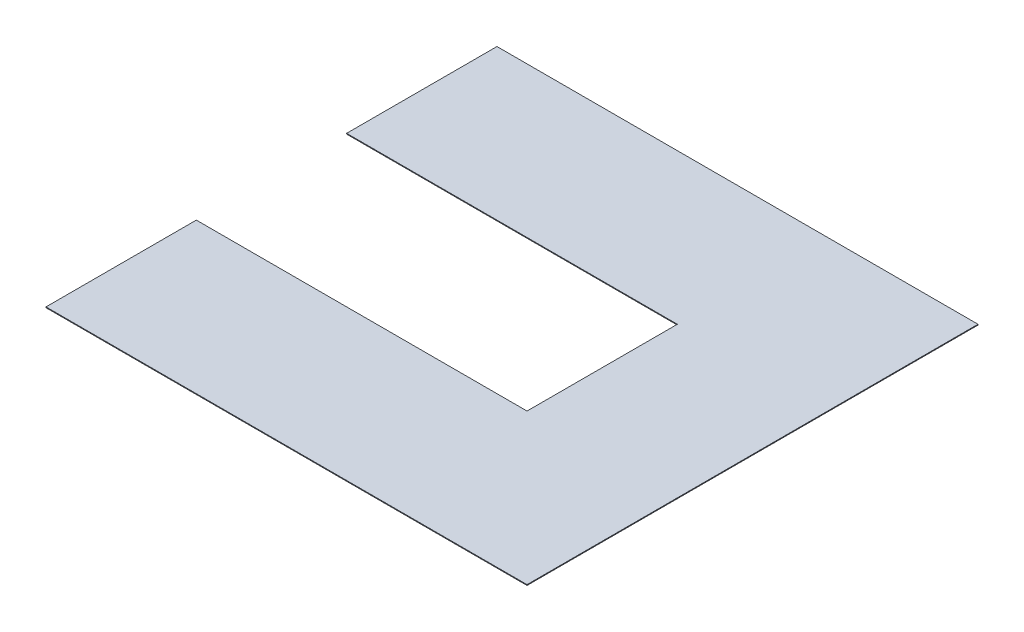
ISO-10303-21;
HEADER;
FILE_DESCRIPTION(('STEP AP214'),'2;1');
FILE_NAME('part.step','',(''),(''),'','','');
FILE_SCHEMA(('AUTOMOTIVE_DESIGN { 1 0 10303 214 1 1 1 1 }'));
ENDSEC;
DATA;
#1=APPLICATION_CONTEXT('core data for automotive mechanical design processes');
#2=APPLICATION_PROTOCOL_DEFINITION('international standard','automotive_design',2000,#1);
#3=PRODUCT_CONTEXT('',#1,'mechanical');
#4=PRODUCT('Part','Part','',(#3));
#5=PRODUCT_RELATED_PRODUCT_CATEGORY('part','',(#4));
#6=PRODUCT_DEFINITION_FORMATION('','',#4);
#7=PRODUCT_DEFINITION_CONTEXT('part definition',#1,'design');
#8=PRODUCT_DEFINITION('design','',#6,#7);
#9=PRODUCT_DEFINITION_SHAPE('','',#8);
#10=(LENGTH_UNIT() NAMED_UNIT(*) SI_UNIT(.MILLI.,.METRE.));
#11=(NAMED_UNIT(*) PLANE_ANGLE_UNIT() SI_UNIT($,.RADIAN.));
#12=(NAMED_UNIT(*) SI_UNIT($,.STERADIAN.) SOLID_ANGLE_UNIT());
#13=UNCERTAINTY_MEASURE_WITH_UNIT(LENGTH_MEASURE(1.E-05),#10,'distance_accuracy_value','');
#14=(GEOMETRIC_REPRESENTATION_CONTEXT(3) GLOBAL_UNCERTAINTY_ASSIGNED_CONTEXT((#13)) GLOBAL_UNIT_ASSIGNED_CONTEXT((#10,
#11,#12)) REPRESENTATION_CONTEXT('',''));
#15=CARTESIAN_POINT('',(0.,0.,0.));
#16=DIRECTION('',(0.,0.,1.));
#17=DIRECTION('',(1.,0.,0.));
#18=AXIS2_PLACEMENT_3D('',#15,#16,#17);
#19=CARTESIAN_POINT('',(8.,0.0126,-3.75));
#20=DIRECTION('',(0.,0.,1.));
#21=DIRECTION('',(1.,0.,0.));
#22=AXIS2_PLACEMENT_3D('',#19,#20,#21);
#23=PLANE('',#22);
#24=DIRECTION('',(-1.,0.,0.));
#25=VECTOR('',#24,1.);
#26=CARTESIAN_POINT('',(8.,0.,-3.75));
#27=LINE('',#26,#25);
#28=CARTESIAN_POINT('',(8.,0.,-3.75));
#29=VERTEX_POINT('',#28);
#30=CARTESIAN_POINT('',(0.,0.,-3.75));
#31=VERTEX_POINT('',#30);
#32=EDGE_CURVE('E140',#29,#31,#27,.T.);
#33=ORIENTED_EDGE('',*,*,#32,.T.);
#34=DIRECTION('',(0.,-1.,0.));
#35=VECTOR('',#34,1.);
#36=CARTESIAN_POINT('',(0.,0.0126,-3.75));
#37=LINE('',#36,#35);
#38=CARTESIAN_POINT('',(0.,0.0126,-3.75));
#39=VERTEX_POINT('',#38);
#40=EDGE_CURVE('E11',#39,#31,#37,.T.);
#41=ORIENTED_EDGE('',*,*,#40,.F.);
#42=DIRECTION('',(-1.,0.,0.));
#43=VECTOR('',#42,1.);
#44=CARTESIAN_POINT('',(8.,0.0126,-3.75));
#45=LINE('',#44,#43);
#46=CARTESIAN_POINT('',(8.,0.0126,-3.75));
#47=VERTEX_POINT('',#46);
#48=EDGE_CURVE('E162',#47,#39,#45,.T.);
#49=ORIENTED_EDGE('',*,*,#48,.F.);
#50=DIRECTION('',(0.,-1.,0.));
#51=VECTOR('',#50,1.);
#52=CARTESIAN_POINT('',(8.,0.0126,-3.75));
#53=LINE('',#52,#51);
#54=EDGE_CURVE('E136',#47,#29,#53,.T.);
#55=ORIENTED_EDGE('',*,*,#54,.T.);
#56=EDGE_LOOP('',(#33,#41,#49,#55));
#57=FACE_BOUND('',#56,.T.);
#58=ADVANCED_FACE('F39',(#57),#23,.F.);
#59=CARTESIAN_POINT('',(0.,0.0126,-3.75));
#60=DIRECTION('',(1.,0.,0.));
#61=DIRECTION('',(0.,0.,-1.));
#62=AXIS2_PLACEMENT_3D('',#59,#60,#61);
#63=PLANE('',#62);
#64=DIRECTION('',(0.,0.,1.));
#65=VECTOR('',#64,1.);
#66=CARTESIAN_POINT('',(0.,0.,-3.75));
#67=LINE('',#66,#65);
#68=CARTESIAN_POINT('',(0.,0.,-1.25));
#69=VERTEX_POINT('',#68);
#70=EDGE_CURVE('E144',#31,#69,#67,.T.);
#71=ORIENTED_EDGE('',*,*,#70,.T.);
#72=DIRECTION('',(0.,-1.,0.));
#73=VECTOR('',#72,1.);
#74=CARTESIAN_POINT('',(0.,0.0126,-1.25));
#75=LINE('',#74,#73);
#76=CARTESIAN_POINT('',(0.,0.0126,-1.25));
#77=VERTEX_POINT('',#76);
#78=EDGE_CURVE('E48',#77,#69,#75,.T.);
#79=ORIENTED_EDGE('',*,*,#78,.F.);
#80=DIRECTION('',(0.,0.,1.));
#81=VECTOR('',#80,1.);
#82=CARTESIAN_POINT('',(0.,0.0126,-3.75));
#83=LINE('',#82,#81);
#84=EDGE_CURVE('E99',#39,#77,#83,.T.);
#85=ORIENTED_EDGE('',*,*,#84,.F.);
#86=ORIENTED_EDGE('',*,*,#40,.T.);
#87=EDGE_LOOP('',(#71,#79,#85,#86));
#88=FACE_BOUND('',#87,.T.);
#89=ADVANCED_FACE('F208',(#88),#63,.F.);
#90=CARTESIAN_POINT('',(0.,0.0126,-1.25));
#91=DIRECTION('',(0.,0.,-1.));
#92=DIRECTION('',(-1.,0.,0.));
#93=AXIS2_PLACEMENT_3D('',#90,#91,#92);
#94=PLANE('',#93);
#95=DIRECTION('',(1.,0.,0.));
#96=VECTOR('',#95,1.);
#97=CARTESIAN_POINT('',(0.,0.,-1.25));
#98=LINE('',#97,#96);
#99=CARTESIAN_POINT('',(5.5,0.,-1.25));
#100=VERTEX_POINT('',#99);
#101=EDGE_CURVE('E147',#69,#100,#98,.T.);
#102=ORIENTED_EDGE('',*,*,#101,.T.);
#103=DIRECTION('',(0.,-1.,0.));
#104=VECTOR('',#103,1.);
#105=CARTESIAN_POINT('',(5.5,0.0126,-1.25));
#106=LINE('',#105,#104);
#107=CARTESIAN_POINT('',(5.5,0.0126,-1.25));
#108=VERTEX_POINT('',#107);
#109=EDGE_CURVE('E173',#108,#100,#106,.T.);
#110=ORIENTED_EDGE('',*,*,#109,.F.);
#111=DIRECTION('',(1.,0.,0.));
#112=VECTOR('',#111,1.);
#113=CARTESIAN_POINT('',(0.,0.0126,-1.25));
#114=LINE('',#113,#112);
#115=EDGE_CURVE('E183',#77,#108,#114,.T.);
#116=ORIENTED_EDGE('',*,*,#115,.F.);
#117=ORIENTED_EDGE('',*,*,#78,.T.);
#118=EDGE_LOOP('',(#102,#110,#116,#117));
#119=FACE_BOUND('',#118,.T.);
#120=ADVANCED_FACE('F181',(#119),#94,.F.);
#121=CARTESIAN_POINT('',(5.5,0.0126,-1.25));
#122=DIRECTION('',(1.,0.,0.));
#123=DIRECTION('',(0.,0.,-1.));
#124=AXIS2_PLACEMENT_3D('',#121,#122,#123);
#125=PLANE('',#124);
#126=DIRECTION('',(0.,0.,1.));
#127=VECTOR('',#126,1.);
#128=CARTESIAN_POINT('',(5.5,0.,-1.25));
#129=LINE('',#128,#127);
#130=CARTESIAN_POINT('',(5.5,0.,1.25));
#131=VERTEX_POINT('',#130);
#132=EDGE_CURVE('E150',#100,#131,#129,.T.);
#133=ORIENTED_EDGE('',*,*,#132,.T.);
#134=DIRECTION('',(0.,-1.,0.));
#135=VECTOR('',#134,1.);
#136=CARTESIAN_POINT('',(5.5,0.0126,1.25));
#137=LINE('',#136,#135);
#138=CARTESIAN_POINT('',(5.5,0.0126,1.25));
#139=VERTEX_POINT('',#138);
#140=EDGE_CURVE('E169',#139,#131,#137,.T.);
#141=ORIENTED_EDGE('',*,*,#140,.F.);
#142=DIRECTION('',(0.,0.,1.));
#143=VECTOR('',#142,1.);
#144=CARTESIAN_POINT('',(5.5,0.0126,-1.25));
#145=LINE('',#144,#143);
#146=EDGE_CURVE('E196',#108,#139,#145,.T.);
#147=ORIENTED_EDGE('',*,*,#146,.F.);
#148=ORIENTED_EDGE('',*,*,#109,.T.);
#149=EDGE_LOOP('',(#133,#141,#147,#148));
#150=FACE_BOUND('',#149,.T.);
#151=ADVANCED_FACE('F191',(#150),#125,.F.);
#152=CARTESIAN_POINT('',(5.5,0.0126,1.25));
#153=DIRECTION('',(0.,0.,1.));
#154=DIRECTION('',(1.,0.,0.));
#155=AXIS2_PLACEMENT_3D('',#152,#153,#154);
#156=PLANE('',#155);
#157=DIRECTION('',(-1.,0.,0.));
#158=VECTOR('',#157,1.);
#159=CARTESIAN_POINT('',(5.5,0.,1.25));
#160=LINE('',#159,#158);
#161=CARTESIAN_POINT('',(0.,0.,1.25));
#162=VERTEX_POINT('',#161);
#163=EDGE_CURVE('E153',#131,#162,#160,.T.);
#164=ORIENTED_EDGE('',*,*,#163,.T.);
#165=DIRECTION('',(0.,-1.,0.));
#166=VECTOR('',#165,1.);
#167=CARTESIAN_POINT('',(0.,0.0126,1.25));
#168=LINE('',#167,#166);
#169=CARTESIAN_POINT('',(0.,0.0126,1.25));
#170=VERTEX_POINT('',#169);
#171=EDGE_CURVE('E129',#170,#162,#168,.T.);
#172=ORIENTED_EDGE('',*,*,#171,.F.);
#173=DIRECTION('',(-1.,0.,0.));
#174=VECTOR('',#173,1.);
#175=CARTESIAN_POINT('',(5.5,0.0126,1.25));
#176=LINE('',#175,#174);
#177=EDGE_CURVE('E118',#139,#170,#176,.T.);
#178=ORIENTED_EDGE('',*,*,#177,.F.);
#179=ORIENTED_EDGE('',*,*,#140,.T.);
#180=EDGE_LOOP('',(#164,#172,#178,#179));
#181=FACE_BOUND('',#180,.T.);
#182=ADVANCED_FACE('F194',(#181),#156,.F.);
#183=CARTESIAN_POINT('',(0.,0.0126,1.25));
#184=DIRECTION('',(1.,0.,0.));
#185=DIRECTION('',(0.,0.,-1.));
#186=AXIS2_PLACEMENT_3D('',#183,#184,#185);
#187=PLANE('',#186);
#188=DIRECTION('',(0.,0.,1.));
#189=VECTOR('',#188,1.);
#190=CARTESIAN_POINT('',(0.,0.,1.25));
#191=LINE('',#190,#189);
#192=CARTESIAN_POINT('',(0.,0.,3.75));
#193=VERTEX_POINT('',#192);
#194=EDGE_CURVE('E127',#162,#193,#191,.T.);
#195=ORIENTED_EDGE('',*,*,#194,.T.);
#196=DIRECTION('',(0.,-1.,0.));
#197=VECTOR('',#196,1.);
#198=CARTESIAN_POINT('',(0.,0.0126,3.75));
#199=LINE('',#198,#197);
#200=CARTESIAN_POINT('',(0.,0.0126,3.75));
#201=VERTEX_POINT('',#200);
#202=EDGE_CURVE('E124',#201,#193,#199,.T.);
#203=ORIENTED_EDGE('',*,*,#202,.F.);
#204=DIRECTION('',(0.,0.,1.));
#205=VECTOR('',#204,1.);
#206=CARTESIAN_POINT('',(0.,0.0126,1.25));
#207=LINE('',#206,#205);
#208=EDGE_CURVE('E112',#170,#201,#207,.T.);
#209=ORIENTED_EDGE('',*,*,#208,.F.);
#210=ORIENTED_EDGE('',*,*,#171,.T.);
#211=EDGE_LOOP('',(#195,#203,#209,#210));
#212=FACE_BOUND('',#211,.T.);
#213=ADVANCED_FACE('F125',(#212),#187,.F.);
#214=CARTESIAN_POINT('',(0.,0.0126,3.75));
#215=DIRECTION('',(0.,0.,-1.));
#216=DIRECTION('',(-1.,0.,0.));
#217=AXIS2_PLACEMENT_3D('',#214,#215,#216);
#218=PLANE('',#217);
#219=DIRECTION('',(1.,0.,0.));
#220=VECTOR('',#219,1.);
#221=CARTESIAN_POINT('',(0.,0.,3.75));
#222=LINE('',#221,#220);
#223=CARTESIAN_POINT('',(8.,0.,3.75));
#224=VERTEX_POINT('',#223);
#225=EDGE_CURVE('E85',#193,#224,#222,.T.);
#226=ORIENTED_EDGE('',*,*,#225,.T.);
#227=DIRECTION('',(0.,-1.,0.));
#228=VECTOR('',#227,1.);
#229=CARTESIAN_POINT('',(8.,0.0126,3.75));
#230=LINE('',#229,#228);
#231=CARTESIAN_POINT('',(8.,0.0126,3.75));
#232=VERTEX_POINT('',#231);
#233=EDGE_CURVE('E130',#232,#224,#230,.T.);
#234=ORIENTED_EDGE('',*,*,#233,.F.);
#235=DIRECTION('',(1.,0.,0.));
#236=VECTOR('',#235,1.);
#237=CARTESIAN_POINT('',(0.,0.0126,3.75));
#238=LINE('',#237,#236);
#239=EDGE_CURVE('E116',#201,#232,#238,.T.);
#240=ORIENTED_EDGE('',*,*,#239,.F.);
#241=ORIENTED_EDGE('',*,*,#202,.T.);
#242=EDGE_LOOP('',(#226,#234,#240,#241));
#243=FACE_BOUND('',#242,.T.);
#244=ADVANCED_FACE('F132',(#243),#218,.F.);
#245=CARTESIAN_POINT('',(8.,0.0126,3.75));
#246=DIRECTION('',(-1.,0.,0.));
#247=DIRECTION('',(0.,0.,1.));
#248=AXIS2_PLACEMENT_3D('',#245,#246,#247);
#249=PLANE('',#248);
#250=DIRECTION('',(0.,0.,-1.));
#251=VECTOR('',#250,1.);
#252=CARTESIAN_POINT('',(8.,0.,3.75));
#253=LINE('',#252,#251);
#254=EDGE_CURVE('E91',#224,#29,#253,.T.);
#255=ORIENTED_EDGE('',*,*,#254,.T.);
#256=ORIENTED_EDGE('',*,*,#54,.F.);
#257=DIRECTION('',(0.,0.,-1.));
#258=VECTOR('',#257,1.);
#259=CARTESIAN_POINT('',(8.,0.0126,3.75));
#260=LINE('',#259,#258);
#261=EDGE_CURVE('E56',#232,#47,#260,.T.);
#262=ORIENTED_EDGE('',*,*,#261,.F.);
#263=ORIENTED_EDGE('',*,*,#233,.T.);
#264=EDGE_LOOP('',(#255,#256,#262,#263));
#265=FACE_BOUND('',#264,.T.);
#266=ADVANCED_FACE('F224',(#265),#249,.F.);
#267=CARTESIAN_POINT('',(0.,0.0126,0.));
#268=DIRECTION('',(0.,1.,0.));
#269=DIRECTION('',(0.,0.,1.));
#270=AXIS2_PLACEMENT_3D('',#267,#268,#269);
#271=PLANE('',#270);
#272=ORIENTED_EDGE('',*,*,#48,.T.);
#273=ORIENTED_EDGE('',*,*,#84,.T.);
#274=ORIENTED_EDGE('',*,*,#115,.T.);
#275=ORIENTED_EDGE('',*,*,#146,.T.);
#276=ORIENTED_EDGE('',*,*,#177,.T.);
#277=ORIENTED_EDGE('',*,*,#208,.T.);
#278=ORIENTED_EDGE('',*,*,#239,.T.);
#279=ORIENTED_EDGE('',*,*,#261,.T.);
#280=EDGE_LOOP('',(#272,#273,#274,#275,#276,#277,#278,#279));
#281=FACE_BOUND('',#280,.T.);
#282=ADVANCED_FACE('F114',(#281),#271,.T.);
#283=CARTESIAN_POINT('',(0.,0.,0.));
#284=DIRECTION('',(0.,1.,0.));
#285=DIRECTION('',(0.,0.,1.));
#286=AXIS2_PLACEMENT_3D('',#283,#284,#285);
#287=PLANE('',#286);
#288=ORIENTED_EDGE('',*,*,#32,.F.);
#289=ORIENTED_EDGE('',*,*,#254,.F.);
#290=ORIENTED_EDGE('',*,*,#225,.F.);
#291=ORIENTED_EDGE('',*,*,#194,.F.);
#292=ORIENTED_EDGE('',*,*,#163,.F.);
#293=ORIENTED_EDGE('',*,*,#132,.F.);
#294=ORIENTED_EDGE('',*,*,#101,.F.);
#295=ORIENTED_EDGE('',*,*,#70,.F.);
#296=EDGE_LOOP('',(#288,#289,#290,#291,#292,#293,#294,#295));
#297=FACE_BOUND('',#296,.T.);
#298=ADVANCED_FACE('F187',(#297),#287,.F.);
#299=CLOSED_SHELL('',(#58,#89,#120,#151,#182,#213,#244,#266,#282,#298));
#300=MANIFOLD_SOLID_BREP('B2',#299);
#301=ADVANCED_BREP_SHAPE_REPRESENTATION('',(#18,#300),#14);
#302=SHAPE_DEFINITION_REPRESENTATION(#9,#301);
ENDSEC;
END-ISO-10303-21;
